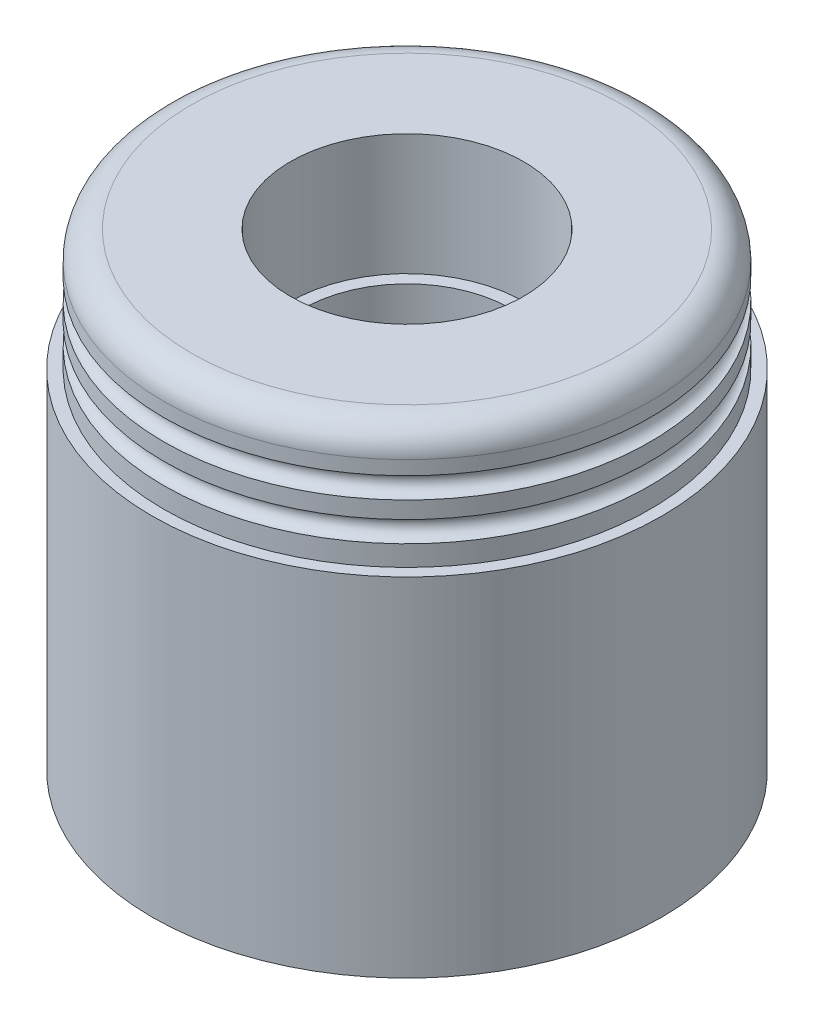
ISO-10303-21;
HEADER;
FILE_DESCRIPTION(('STEP AP214'),'2;1');
FILE_NAME('part.step','',(''),(''),'','','');
FILE_SCHEMA(('AUTOMOTIVE_DESIGN { 1 0 10303 214 1 1 1 1 }'));
ENDSEC;
DATA;
#1=APPLICATION_CONTEXT('core data for automotive mechanical design processes');
#2=APPLICATION_PROTOCOL_DEFINITION('international standard','automotive_design',2000,#1);
#3=PRODUCT_CONTEXT('',#1,'mechanical');
#4=PRODUCT('Part','Part','',(#3));
#5=PRODUCT_RELATED_PRODUCT_CATEGORY('part','',(#4));
#6=PRODUCT_DEFINITION_FORMATION('','',#4);
#7=PRODUCT_DEFINITION_CONTEXT('part definition',#1,'design');
#8=PRODUCT_DEFINITION('design','',#6,#7);
#9=PRODUCT_DEFINITION_SHAPE('','',#8);
#10=(LENGTH_UNIT() NAMED_UNIT(*) SI_UNIT(.MILLI.,.METRE.));
#11=(NAMED_UNIT(*) PLANE_ANGLE_UNIT() SI_UNIT($,.RADIAN.));
#12=(NAMED_UNIT(*) SI_UNIT($,.STERADIAN.) SOLID_ANGLE_UNIT());
#13=UNCERTAINTY_MEASURE_WITH_UNIT(LENGTH_MEASURE(1.E-05),#10,'distance_accuracy_value','');
#14=(GEOMETRIC_REPRESENTATION_CONTEXT(3) GLOBAL_UNCERTAINTY_ASSIGNED_CONTEXT((#13)) GLOBAL_UNIT_ASSIGNED_CONTEXT((#10,
#11,#12)) REPRESENTATION_CONTEXT('',''));
#15=CARTESIAN_POINT('',(0.,0.,0.));
#16=DIRECTION('',(0.,0.,1.));
#17=DIRECTION('',(1.,0.,0.));
#18=AXIS2_PLACEMENT_3D('',#15,#16,#17);
#19=CARTESIAN_POINT('',(0.,21.4122,0.));
#20=DIRECTION('',(0.,-1.,0.));
#21=DIRECTION('',(0.,0.,-1.));
#22=AXIS2_PLACEMENT_3D('',#19,#20,#21);
#23=CYLINDRICAL_SURFACE('',#22,11.1125);
#24=CARTESIAN_POINT('',(0.,15.875,0.));
#25=DIRECTION('',(0.,1.,0.));
#26=DIRECTION('',(0.,0.,1.));
#27=AXIS2_PLACEMENT_3D('',#24,#25,#26);
#28=CIRCLE('',#27,11.1125);
#29=CARTESIAN_POINT('',(0.,15.875,11.1125));
#30=VERTEX_POINT('',#29);
#31=EDGE_CURVE('E53',#30,#30,#28,.T.);
#32=ORIENTED_EDGE('',*,*,#31,.T.);
#33=EDGE_LOOP('',(#32));
#34=FACE_BOUND('',#33,.T.);
#35=CARTESIAN_POINT('',(0.,16.8107638450534,0.));
#36=DIRECTION('',(0.,-1.,0.));
#37=DIRECTION('',(0.,0.,-1.));
#38=AXIS2_PLACEMENT_3D('',#35,#36,#37);
#39=CIRCLE('',#38,11.1125);
#40=CARTESIAN_POINT('',(0.,16.8107638450534,-11.1125));
#41=VERTEX_POINT('',#40);
#42=EDGE_CURVE('E63',#41,#41,#39,.T.);
#43=ORIENTED_EDGE('',*,*,#42,.T.);
#44=EDGE_LOOP('',(#43));
#45=FACE_BOUND('',#44,.T.);
#46=ADVANCED_FACE('F42',(#34,#45),#23,.T.);
#47=CARTESIAN_POINT('',(0.,20.1422,0.));
#48=DIRECTION('',(0.,1.,0.));
#49=DIRECTION('',(0.,0.,1.));
#50=AXIS2_PLACEMENT_3D('',#47,#48,#49);
#51=CIRCLE('',#50,11.1125);
#52=CARTESIAN_POINT('',(0.,20.1422,11.1125));
#53=VERTEX_POINT('',#52);
#54=EDGE_CURVE('E11',#53,#53,#51,.F.);
#55=ORIENTED_EDGE('',*,*,#54,.T.);
#56=EDGE_LOOP('',(#55));
#57=FACE_BOUND('',#56,.T.);
#58=CARTESIAN_POINT('',(0.,19.5039148697719,0.));
#59=DIRECTION('',(0.,-1.,0.));
#60=DIRECTION('',(0.,0.,-1.));
#61=AXIS2_PLACEMENT_3D('',#58,#59,#60);
#62=CIRCLE('',#61,11.1125);
#63=CARTESIAN_POINT('',(0.,19.5039148697719,-11.1125));
#64=VERTEX_POINT('',#63);
#65=EDGE_CURVE('E74',#64,#64,#62,.T.);
#66=ORIENTED_EDGE('',*,*,#65,.F.);
#67=EDGE_LOOP('',(#66));
#68=FACE_BOUND('',#67,.T.);
#69=ADVANCED_FACE('F81',(#57,#68),#23,.T.);
#70=CARTESIAN_POINT('',(0.,21.4122,0.));
#71=DIRECTION('',(0.,1.,0.));
#72=DIRECTION('',(0.,0.,1.));
#73=AXIS2_PLACEMENT_3D('',#70,#71,#72);
#74=PLANE('',#73);
#75=CARTESIAN_POINT('',(0.,21.4122,0.));
#76=DIRECTION('',(0.,1.,0.));
#77=DIRECTION('',(0.,0.,1.));
#78=AXIS2_PLACEMENT_3D('',#75,#76,#77);
#79=CIRCLE('',#78,9.8425);
#80=CARTESIAN_POINT('',(0.,21.4122,9.8425));
#81=VERTEX_POINT('',#80);
#82=EDGE_CURVE('E49',#81,#81,#79,.T.);
#83=ORIENTED_EDGE('',*,*,#82,.T.);
#84=EDGE_LOOP('',(#83));
#85=FACE_BOUND('',#84,.T.);
#86=CARTESIAN_POINT('',(0.,21.4122,0.));
#87=DIRECTION('',(0.,1.,0.));
#88=DIRECTION('',(0.,0.,1.));
#89=AXIS2_PLACEMENT_3D('',#86,#87,#88);
#90=CIRCLE('',#89,5.334);
#91=CARTESIAN_POINT('',(0.,21.4122,5.334));
#92=VERTEX_POINT('',#91);
#93=EDGE_CURVE('E57',#92,#92,#90,.T.);
#94=ORIENTED_EDGE('',*,*,#93,.F.);
#95=EDGE_LOOP('',(#94));
#96=FACE_BOUND('',#95,.T.);
#97=ADVANCED_FACE('F83',(#85,#96),#74,.T.);
#98=CARTESIAN_POINT('',(0.,15.875,0.));
#99=DIRECTION('',(0.,1.,0.));
#100=DIRECTION('',(0.,0.,1.));
#101=AXIS2_PLACEMENT_3D('',#98,#99,#100);
#102=PLANE('',#101);
#103=ORIENTED_EDGE('',*,*,#31,.F.);
#104=EDGE_LOOP('',(#103));
#105=FACE_BOUND('',#104,.T.);
#106=CARTESIAN_POINT('',(0.,15.875,0.));
#107=DIRECTION('',(0.,1.,0.));
#108=DIRECTION('',(0.,0.,1.));
#109=AXIS2_PLACEMENT_3D('',#106,#107,#108);
#110=CIRCLE('',#109,5.334);
#111=CARTESIAN_POINT('',(0.,15.875,5.334));
#112=VERTEX_POINT('',#111);
#113=EDGE_CURVE('E60',#112,#112,#110,.T.);
#114=ORIENTED_EDGE('',*,*,#113,.T.);
#115=EDGE_LOOP('',(#114));
#116=FACE_BOUND('',#115,.T.);
#117=ADVANCED_FACE('F89',(#105,#116),#102,.F.);
#118=CARTESIAN_POINT('',(0.,21.4122,0.));
#119=DIRECTION('',(0.,-1.,0.));
#120=DIRECTION('',(0.,0.,-1.));
#121=AXIS2_PLACEMENT_3D('',#118,#119,#120);
#122=CYLINDRICAL_SURFACE('',#121,5.334);
#123=ORIENTED_EDGE('',*,*,#93,.T.);
#124=EDGE_LOOP('',(#123));
#125=FACE_BOUND('',#124,.T.);
#126=ORIENTED_EDGE('',*,*,#113,.F.);
#127=EDGE_LOOP('',(#126));
#128=FACE_BOUND('',#127,.T.);
#129=ADVANCED_FACE('F112',(#125,#128),#122,.F.);
#130=CARTESIAN_POINT('',(0.,20.1422,0.));
#131=DIRECTION('',(0.,1.,0.));
#132=DIRECTION('',(0.,0.,1.));
#133=AXIS2_PLACEMENT_3D('',#130,#131,#132);
#134=TOROIDAL_SURFACE('',#133,9.8425,1.27);
#135=ORIENTED_EDGE('',*,*,#54,.F.);
#136=EDGE_LOOP('',(#135));
#137=FACE_BOUND('',#136,.T.);
#138=ORIENTED_EDGE('',*,*,#82,.F.);
#139=EDGE_LOOP('',(#138));
#140=FACE_BOUND('',#139,.T.);
#141=ADVANCED_FACE('F44',(#137,#140),#134,.T.);
#142=CARTESIAN_POINT('',(0.,19.023755627931,0.));
#143=DIRECTION('',(0.,-1.,0.));
#144=DIRECTION('',(0.,0.,-1.));
#145=AXIS2_PLACEMENT_3D('',#142,#143,#144);
#146=TOROIDAL_SURFACE('',#145,11.1125,0.480159241840965);
#147=ORIENTED_EDGE('',*,*,#65,.T.);
#148=EDGE_LOOP('',(#147));
#149=FACE_BOUND('',#148,.T.);
#150=CARTESIAN_POINT('',(0.,18.54359638609,0.));
#151=DIRECTION('',(0.,-1.,0.));
#152=DIRECTION('',(0.,0.,-1.));
#153=AXIS2_PLACEMENT_3D('',#150,#151,#152);
#154=CIRCLE('',#153,11.1125);
#155=CARTESIAN_POINT('',(0.,18.54359638609,-11.1125));
#156=VERTEX_POINT('',#155);
#157=EDGE_CURVE('E71',#156,#156,#154,.T.);
#158=ORIENTED_EDGE('',*,*,#157,.F.);
#159=EDGE_LOOP('',(#158));
#160=FACE_BOUND('',#159,.T.);
#161=ADVANCED_FACE('F78',(#149,#160),#146,.F.);
#162=ORIENTED_EDGE('',*,*,#157,.T.);
#163=EDGE_LOOP('',(#162));
#164=FACE_BOUND('',#163,.T.);
#165=CARTESIAN_POINT('',(0.,17.7710823287353,0.));
#166=DIRECTION('',(0.,-1.,0.));
#167=DIRECTION('',(0.,0.,-1.));
#168=AXIS2_PLACEMENT_3D('',#165,#166,#167);
#169=CIRCLE('',#168,11.1125);
#170=CARTESIAN_POINT('',(0.,17.7710823287353,-11.1125));
#171=VERTEX_POINT('',#170);
#172=EDGE_CURVE('E68',#171,#171,#169,.T.);
#173=ORIENTED_EDGE('',*,*,#172,.F.);
#174=EDGE_LOOP('',(#173));
#175=FACE_BOUND('',#174,.T.);
#176=ADVANCED_FACE('F84',(#164,#175),#23,.T.);
#177=CARTESIAN_POINT('',(0.,17.2909230868944,0.));
#178=DIRECTION('',(0.,-1.,0.));
#179=DIRECTION('',(0.,0.,-1.));
#180=AXIS2_PLACEMENT_3D('',#177,#178,#179);
#181=TOROIDAL_SURFACE('',#180,11.1125,0.480159241840965);
#182=ORIENTED_EDGE('',*,*,#172,.T.);
#183=EDGE_LOOP('',(#182));
#184=FACE_BOUND('',#183,.T.);
#185=ORIENTED_EDGE('',*,*,#42,.F.);
#186=EDGE_LOOP('',(#185));
#187=FACE_BOUND('',#186,.T.);
#188=ADVANCED_FACE('F94',(#184,#187),#181,.F.);
#189=CLOSED_SHELL('',(#46,#69,#97,#117,#129,#141,#161,#176,#188));
#190=MANIFOLD_SOLID_BREP('B2',#189);
#191=CARTESIAN_POINT('',(0.,15.875,0.));
#192=DIRECTION('',(0.,1.,0.));
#193=DIRECTION('',(0.,0.,1.));
#194=AXIS2_PLACEMENT_3D('',#191,#192,#193);
#195=PLANE('',#194);
#196=CARTESIAN_POINT('',(0.,15.875,0.));
#197=DIRECTION('',(0.,1.,0.));
#198=DIRECTION('',(0.,0.,1.));
#199=AXIS2_PLACEMENT_3D('',#196,#197,#198);
#200=CIRCLE('',#199,11.6459);
#201=CARTESIAN_POINT('',(0.,15.875,11.6459));
#202=VERTEX_POINT('',#201);
#203=EDGE_CURVE('E41',#202,#202,#200,.T.);
#204=ORIENTED_EDGE('',*,*,#203,.T.);
#205=EDGE_LOOP('',(#204));
#206=FACE_BOUND('',#205,.T.);
#207=CARTESIAN_POINT('',(0.,15.875,0.));
#208=DIRECTION('',(0.,1.,0.));
#209=DIRECTION('',(0.,0.,1.));
#210=AXIS2_PLACEMENT_3D('',#207,#208,#209);
#211=CIRCLE('',#210,4.7625);
#212=CARTESIAN_POINT('',(0.,15.875,4.7625));
#213=VERTEX_POINT('',#212);
#214=EDGE_CURVE('E187',#213,#213,#211,.T.);
#215=ORIENTED_EDGE('',*,*,#214,.F.);
#216=EDGE_LOOP('',(#215));
#217=FACE_BOUND('',#216,.T.);
#218=ADVANCED_FACE('F176',(#206,#217),#195,.T.);
#219=CARTESIAN_POINT('',(0.,0.,0.));
#220=DIRECTION('',(0.,1.,0.));
#221=DIRECTION('',(0.,0.,1.));
#222=AXIS2_PLACEMENT_3D('',#219,#220,#221);
#223=PLANE('',#222);
#224=CARTESIAN_POINT('',(0.,0.,0.));
#225=DIRECTION('',(0.,1.,0.));
#226=DIRECTION('',(0.,0.,1.));
#227=AXIS2_PLACEMENT_3D('',#224,#225,#226);
#228=CIRCLE('',#227,11.6459);
#229=CARTESIAN_POINT('',(0.,0.,11.6459));
#230=VERTEX_POINT('',#229);
#231=EDGE_CURVE('E180',#230,#230,#228,.T.);
#232=ORIENTED_EDGE('',*,*,#231,.F.);
#233=EDGE_LOOP('',(#232));
#234=FACE_BOUND('',#233,.T.);
#235=CARTESIAN_POINT('',(0.,0.,0.));
#236=DIRECTION('',(0.,1.,0.));
#237=DIRECTION('',(0.,0.,1.));
#238=AXIS2_PLACEMENT_3D('',#235,#236,#237);
#239=CIRCLE('',#238,4.7625);
#240=CARTESIAN_POINT('',(0.,0.,4.7625));
#241=VERTEX_POINT('',#240);
#242=EDGE_CURVE('E189',#241,#241,#239,.T.);
#243=ORIENTED_EDGE('',*,*,#242,.T.);
#244=EDGE_LOOP('',(#243));
#245=FACE_BOUND('',#244,.T.);
#246=ADVANCED_FACE('F199',(#234,#245),#223,.F.);
#247=CARTESIAN_POINT('',(0.,15.875,0.));
#248=DIRECTION('',(0.,-1.,0.));
#249=DIRECTION('',(0.,0.,-1.));
#250=AXIS2_PLACEMENT_3D('',#247,#248,#249);
#251=CYLINDRICAL_SURFACE('',#250,11.6459);
#252=ORIENTED_EDGE('',*,*,#203,.F.);
#253=EDGE_LOOP('',(#252));
#254=FACE_BOUND('',#253,.T.);
#255=ORIENTED_EDGE('',*,*,#231,.T.);
#256=EDGE_LOOP('',(#255));
#257=FACE_BOUND('',#256,.T.);
#258=ADVANCED_FACE('F178',(#254,#257),#251,.T.);
#259=CARTESIAN_POINT('',(0.,15.875,0.));
#260=DIRECTION('',(0.,-1.,0.));
#261=DIRECTION('',(0.,0.,-1.));
#262=AXIS2_PLACEMENT_3D('',#259,#260,#261);
#263=CYLINDRICAL_SURFACE('',#262,4.7625);
#264=ORIENTED_EDGE('',*,*,#214,.T.);
#265=EDGE_LOOP('',(#264));
#266=FACE_BOUND('',#265,.T.);
#267=ORIENTED_EDGE('',*,*,#242,.F.);
#268=EDGE_LOOP('',(#267));
#269=FACE_BOUND('',#268,.T.);
#270=ADVANCED_FACE('F195',(#266,#269),#263,.F.);
#271=CLOSED_SHELL('',(#218,#246,#258,#270));
#272=MANIFOLD_SOLID_BREP('B6',#271);
#273=ADVANCED_BREP_SHAPE_REPRESENTATION('',(#18,#190,#272),#14);
#274=SHAPE_DEFINITION_REPRESENTATION(#9,#273);
ENDSEC;
END-ISO-10303-21;
